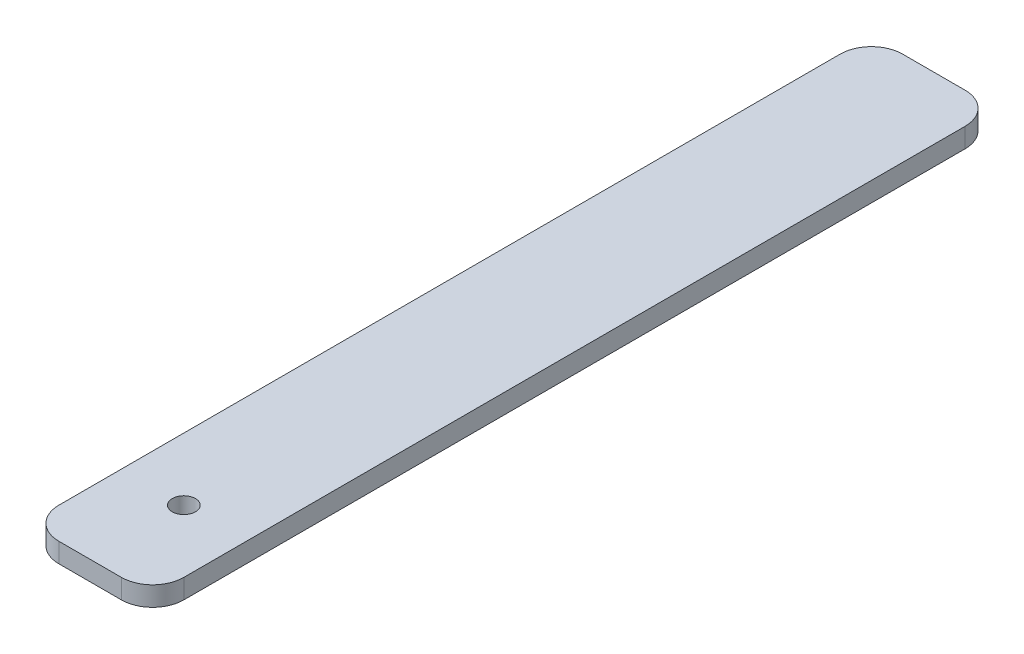
ISO-10303-21;
HEADER;
FILE_DESCRIPTION(('STEP AP214'),'2;1');
FILE_NAME('part.step','',(''),(''),'','','');
FILE_SCHEMA(('AUTOMOTIVE_DESIGN { 1 0 10303 214 1 1 1 1 }'));
ENDSEC;
DATA;
#1=APPLICATION_CONTEXT('core data for automotive mechanical design processes');
#2=APPLICATION_PROTOCOL_DEFINITION('international standard','automotive_design',2000,#1);
#3=PRODUCT_CONTEXT('',#1,'mechanical');
#4=PRODUCT('Part','Part','',(#3));
#5=PRODUCT_RELATED_PRODUCT_CATEGORY('part','',(#4));
#6=PRODUCT_DEFINITION_FORMATION('','',#4);
#7=PRODUCT_DEFINITION_CONTEXT('part definition',#1,'design');
#8=PRODUCT_DEFINITION('design','',#6,#7);
#9=PRODUCT_DEFINITION_SHAPE('','',#8);
#10=(LENGTH_UNIT() NAMED_UNIT(*) SI_UNIT(.MILLI.,.METRE.));
#11=(NAMED_UNIT(*) PLANE_ANGLE_UNIT() SI_UNIT($,.RADIAN.));
#12=(NAMED_UNIT(*) SI_UNIT($,.STERADIAN.) SOLID_ANGLE_UNIT());
#13=UNCERTAINTY_MEASURE_WITH_UNIT(LENGTH_MEASURE(1.E-05),#10,'distance_accuracy_value','');
#14=(GEOMETRIC_REPRESENTATION_CONTEXT(3) GLOBAL_UNCERTAINTY_ASSIGNED_CONTEXT((#13)) GLOBAL_UNIT_ASSIGNED_CONTEXT((#10,
#11,#12)) REPRESENTATION_CONTEXT('',''));
#15=CARTESIAN_POINT('',(0.,0.,0.));
#16=DIRECTION('',(0.,0.,1.));
#17=DIRECTION('',(1.,0.,0.));
#18=AXIS2_PLACEMENT_3D('',#15,#16,#17);
#19=CARTESIAN_POINT('',(0.,1.5875,0.));
#20=DIRECTION('',(0.,-1.,0.));
#21=DIRECTION('',(0.,0.,-1.));
#22=AXIS2_PLACEMENT_3D('',#19,#20,#21);
#23=PLANE('',#22);
#24=DIRECTION('',(-1.,0.,0.));
#25=VECTOR('',#24,1.);
#26=CARTESIAN_POINT('',(0.,1.5875,-68.58));
#27=LINE('',#26,#25);
#28=CARTESIAN_POINT('',(7.62,1.5875,-68.58));
#29=VERTEX_POINT('',#28);
#30=CARTESIAN_POINT('',(2.54,1.5875,-68.58));
#31=VERTEX_POINT('',#30);
#32=EDGE_CURVE('E136',#29,#31,#27,.T.);
#33=ORIENTED_EDGE('',*,*,#32,.T.);
#34=CARTESIAN_POINT('',(2.54,1.5875,-66.04));
#35=DIRECTION('',(0.,-1.,0.));
#36=DIRECTION('',(0.,0.,-1.));
#37=AXIS2_PLACEMENT_3D('',#34,#35,#36);
#38=CIRCLE('',#37,2.54);
#39=CARTESIAN_POINT('',(0.,1.5875,-66.04));
#40=VERTEX_POINT('',#39);
#41=EDGE_CURVE('E155',#31,#40,#38,.F.);
#42=ORIENTED_EDGE('',*,*,#41,.T.);
#43=DIRECTION('',(0.,0.,1.));
#44=VECTOR('',#43,1.);
#45=CARTESIAN_POINT('',(0.,1.5875,0.));
#46=LINE('',#45,#44);
#47=CARTESIAN_POINT('',(0.,1.5875,-2.54));
#48=VERTEX_POINT('',#47);
#49=EDGE_CURVE('E119',#40,#48,#46,.T.);
#50=ORIENTED_EDGE('',*,*,#49,.T.);
#51=CARTESIAN_POINT('',(2.54,1.5875,-2.54));
#52=DIRECTION('',(0.,-1.,0.));
#53=DIRECTION('',(0.,0.,-1.));
#54=AXIS2_PLACEMENT_3D('',#51,#52,#53);
#55=CIRCLE('',#54,2.54);
#56=CARTESIAN_POINT('',(2.54,1.5875,0.));
#57=VERTEX_POINT('',#56);
#58=EDGE_CURVE('E150',#48,#57,#55,.F.);
#59=ORIENTED_EDGE('',*,*,#58,.T.);
#60=DIRECTION('',(1.,0.,0.));
#61=VECTOR('',#60,1.);
#62=CARTESIAN_POINT('',(0.,1.5875,0.));
#63=LINE('',#62,#61);
#64=CARTESIAN_POINT('',(7.62,1.5875,0.));
#65=VERTEX_POINT('',#64);
#66=EDGE_CURVE('E166',#57,#65,#63,.T.);
#67=ORIENTED_EDGE('',*,*,#66,.T.);
#68=CARTESIAN_POINT('',(7.62,1.5875,-2.54));
#69=DIRECTION('',(0.,-1.,0.));
#70=DIRECTION('',(0.,0.,-1.));
#71=AXIS2_PLACEMENT_3D('',#68,#69,#70);
#72=CIRCLE('',#71,2.54);
#73=CARTESIAN_POINT('',(10.16,1.5875,-2.54));
#74=VERTEX_POINT('',#73);
#75=EDGE_CURVE('E55',#65,#74,#72,.F.);
#76=ORIENTED_EDGE('',*,*,#75,.T.);
#77=DIRECTION('',(0.,0.,-1.));
#78=VECTOR('',#77,1.);
#79=CARTESIAN_POINT('',(10.16,1.5875,0.));
#80=LINE('',#79,#78);
#81=CARTESIAN_POINT('',(10.16,1.5875,-66.04));
#82=VERTEX_POINT('',#81);
#83=EDGE_CURVE('E174',#74,#82,#80,.T.);
#84=ORIENTED_EDGE('',*,*,#83,.T.);
#85=CARTESIAN_POINT('',(7.62,1.5875,-66.04));
#86=DIRECTION('',(0.,-1.,0.));
#87=DIRECTION('',(0.,0.,-1.));
#88=AXIS2_PLACEMENT_3D('',#85,#86,#87);
#89=CIRCLE('',#88,2.54);
#90=EDGE_CURVE('E153',#82,#29,#89,.F.);
#91=ORIENTED_EDGE('',*,*,#90,.T.);
#92=EDGE_LOOP('',(#33,#42,#50,#59,#67,#76,#84,#91));
#93=FACE_BOUND('',#92,.T.);
#94=CARTESIAN_POINT('',(5.08,1.5875,-7.62));
#95=DIRECTION('',(0.,1.,0.));
#96=DIRECTION('',(0.,0.,1.));
#97=AXIS2_PLACEMENT_3D('',#94,#95,#96);
#98=CIRCLE('',#97,0.939800000000001);
#99=CARTESIAN_POINT('',(5.08,1.5875,-6.6802));
#100=VERTEX_POINT('',#99);
#101=EDGE_CURVE('E127',#100,#100,#98,.T.);
#102=ORIENTED_EDGE('',*,*,#101,.F.);
#103=EDGE_LOOP('',(#102));
#104=FACE_BOUND('',#103,.T.);
#105=ADVANCED_FACE('F33',(#93,#104),#23,.F.);
#106=CARTESIAN_POINT('',(0.,0.,0.));
#107=DIRECTION('',(0.,-1.,0.));
#108=DIRECTION('',(0.,0.,-1.));
#109=AXIS2_PLACEMENT_3D('',#106,#107,#108);
#110=PLANE('',#109);
#111=DIRECTION('',(0.,0.,1.));
#112=VECTOR('',#111,1.);
#113=CARTESIAN_POINT('',(0.,0.,0.));
#114=LINE('',#113,#112);
#115=CARTESIAN_POINT('',(0.,0.,-66.04));
#116=VERTEX_POINT('',#115);
#117=CARTESIAN_POINT('',(0.,0.,-2.54));
#118=VERTEX_POINT('',#117);
#119=EDGE_CURVE('E116',#116,#118,#114,.T.);
#120=ORIENTED_EDGE('',*,*,#119,.F.);
#121=CARTESIAN_POINT('',(2.54,0.,-66.04));
#122=DIRECTION('',(0.,-1.,0.));
#123=DIRECTION('',(0.,0.,-1.));
#124=AXIS2_PLACEMENT_3D('',#121,#122,#123);
#125=CIRCLE('',#124,2.54);
#126=CARTESIAN_POINT('',(2.54,0.,-68.58));
#127=VERTEX_POINT('',#126);
#128=EDGE_CURVE('E99',#116,#127,#125,.T.);
#129=ORIENTED_EDGE('',*,*,#128,.T.);
#130=DIRECTION('',(-1.,0.,0.));
#131=VECTOR('',#130,1.);
#132=CARTESIAN_POINT('',(0.,0.,-68.58));
#133=LINE('',#132,#131);
#134=CARTESIAN_POINT('',(7.62,0.,-68.58));
#135=VERTEX_POINT('',#134);
#136=EDGE_CURVE('E140',#135,#127,#133,.T.);
#137=ORIENTED_EDGE('',*,*,#136,.F.);
#138=CARTESIAN_POINT('',(7.62,0.,-66.04));
#139=DIRECTION('',(0.,-1.,0.));
#140=DIRECTION('',(0.,0.,-1.));
#141=AXIS2_PLACEMENT_3D('',#138,#139,#140);
#142=CIRCLE('',#141,2.54);
#143=CARTESIAN_POINT('',(10.16,0.,-66.04));
#144=VERTEX_POINT('',#143);
#145=EDGE_CURVE('E110',#135,#144,#142,.T.);
#146=ORIENTED_EDGE('',*,*,#145,.T.);
#147=DIRECTION('',(0.,0.,-1.));
#148=VECTOR('',#147,1.);
#149=CARTESIAN_POINT('',(10.16,0.,0.));
#150=LINE('',#149,#148);
#151=CARTESIAN_POINT('',(10.16,0.,-2.54));
#152=VERTEX_POINT('',#151);
#153=EDGE_CURVE('E130',#152,#144,#150,.T.);
#154=ORIENTED_EDGE('',*,*,#153,.F.);
#155=CARTESIAN_POINT('',(7.62,0.,-2.54));
#156=DIRECTION('',(0.,-1.,0.));
#157=DIRECTION('',(0.,0.,-1.));
#158=AXIS2_PLACEMENT_3D('',#155,#156,#157);
#159=CIRCLE('',#158,2.54);
#160=CARTESIAN_POINT('',(7.62,0.,0.));
#161=VERTEX_POINT('',#160);
#162=EDGE_CURVE('E144',#152,#161,#159,.T.);
#163=ORIENTED_EDGE('',*,*,#162,.T.);
#164=DIRECTION('',(1.,0.,0.));
#165=VECTOR('',#164,1.);
#166=CARTESIAN_POINT('',(0.,0.,0.));
#167=LINE('',#166,#165);
#168=CARTESIAN_POINT('',(2.54,0.,0.));
#169=VERTEX_POINT('',#168);
#170=EDGE_CURVE('E126',#169,#161,#167,.T.);
#171=ORIENTED_EDGE('',*,*,#170,.F.);
#172=CARTESIAN_POINT('',(2.54,0.,-2.54));
#173=DIRECTION('',(0.,-1.,0.));
#174=DIRECTION('',(0.,0.,-1.));
#175=AXIS2_PLACEMENT_3D('',#172,#173,#174);
#176=CIRCLE('',#175,2.54);
#177=EDGE_CURVE('E120',#169,#118,#176,.T.);
#178=ORIENTED_EDGE('',*,*,#177,.T.);
#179=EDGE_LOOP('',(#120,#129,#137,#146,#154,#163,#171,#178));
#180=FACE_BOUND('',#179,.T.);
#181=CARTESIAN_POINT('',(5.08,0.,-7.62));
#182=DIRECTION('',(0.,1.,0.));
#183=DIRECTION('',(0.,0.,1.));
#184=AXIS2_PLACEMENT_3D('',#181,#182,#183);
#185=CIRCLE('',#184,0.939800000000001);
#186=CARTESIAN_POINT('',(5.08,0.,-6.6802));
#187=VERTEX_POINT('',#186);
#188=EDGE_CURVE('E133',#187,#187,#185,.T.);
#189=ORIENTED_EDGE('',*,*,#188,.T.);
#190=EDGE_LOOP('',(#189));
#191=FACE_BOUND('',#190,.T.);
#192=ADVANCED_FACE('F123',(#180,#191),#110,.T.);
#193=CARTESIAN_POINT('',(0.,1.5875,0.));
#194=DIRECTION('',(1.,0.,0.));
#195=DIRECTION('',(0.,0.,-1.));
#196=AXIS2_PLACEMENT_3D('',#193,#194,#195);
#197=PLANE('',#196);
#198=ORIENTED_EDGE('',*,*,#49,.F.);
#199=DIRECTION('',(0.,-1.,0.));
#200=VECTOR('',#199,1.);
#201=CARTESIAN_POINT('',(0.,1.5875,-66.04));
#202=LINE('',#201,#200);
#203=EDGE_CURVE('E103',#40,#116,#202,.T.);
#204=ORIENTED_EDGE('',*,*,#203,.T.);
#205=ORIENTED_EDGE('',*,*,#119,.T.);
#206=DIRECTION('',(0.,-1.,0.));
#207=VECTOR('',#206,1.);
#208=CARTESIAN_POINT('',(0.,1.5875,-2.54));
#209=LINE('',#208,#207);
#210=EDGE_CURVE('E121',#118,#48,#209,.F.);
#211=ORIENTED_EDGE('',*,*,#210,.T.);
#212=EDGE_LOOP('',(#198,#204,#205,#211));
#213=FACE_BOUND('',#212,.T.);
#214=ADVANCED_FACE('F115',(#213),#197,.F.);
#215=CARTESIAN_POINT('',(0.,1.5875,0.));
#216=DIRECTION('',(0.,0.,-1.));
#217=DIRECTION('',(-1.,0.,0.));
#218=AXIS2_PLACEMENT_3D('',#215,#216,#217);
#219=PLANE('',#218);
#220=ORIENTED_EDGE('',*,*,#170,.T.);
#221=DIRECTION('',(0.,-1.,0.));
#222=VECTOR('',#221,1.);
#223=CARTESIAN_POINT('',(7.62,1.5875,0.));
#224=LINE('',#223,#222);
#225=EDGE_CURVE('E11',#161,#65,#224,.F.);
#226=ORIENTED_EDGE('',*,*,#225,.T.);
#227=ORIENTED_EDGE('',*,*,#66,.F.);
#228=DIRECTION('',(0.,-1.,0.));
#229=VECTOR('',#228,1.);
#230=CARTESIAN_POINT('',(2.54,1.5875,0.));
#231=LINE('',#230,#229);
#232=EDGE_CURVE('E41',#57,#169,#231,.T.);
#233=ORIENTED_EDGE('',*,*,#232,.T.);
#234=EDGE_LOOP('',(#220,#226,#227,#233));
#235=FACE_BOUND('',#234,.T.);
#236=ADVANCED_FACE('F164',(#235),#219,.F.);
#237=CARTESIAN_POINT('',(10.16,1.5875,0.));
#238=DIRECTION('',(-1.,0.,0.));
#239=DIRECTION('',(0.,0.,1.));
#240=AXIS2_PLACEMENT_3D('',#237,#238,#239);
#241=PLANE('',#240);
#242=ORIENTED_EDGE('',*,*,#153,.T.);
#243=DIRECTION('',(0.,-1.,0.));
#244=VECTOR('',#243,1.);
#245=CARTESIAN_POINT('',(10.16,1.5875,-66.04));
#246=LINE('',#245,#244);
#247=EDGE_CURVE('E48',#144,#82,#246,.F.);
#248=ORIENTED_EDGE('',*,*,#247,.T.);
#249=ORIENTED_EDGE('',*,*,#83,.F.);
#250=DIRECTION('',(0.,-1.,0.));
#251=VECTOR('',#250,1.);
#252=CARTESIAN_POINT('',(10.16,1.5875,-2.54));
#253=LINE('',#252,#251);
#254=EDGE_CURVE('E157',#74,#152,#253,.T.);
#255=ORIENTED_EDGE('',*,*,#254,.T.);
#256=EDGE_LOOP('',(#242,#248,#249,#255));
#257=FACE_BOUND('',#256,.T.);
#258=ADVANCED_FACE('F173',(#257),#241,.F.);
#259=CARTESIAN_POINT('',(0.,1.5875,-68.58));
#260=DIRECTION('',(0.,0.,1.));
#261=DIRECTION('',(1.,0.,0.));
#262=AXIS2_PLACEMENT_3D('',#259,#260,#261);
#263=PLANE('',#262);
#264=ORIENTED_EDGE('',*,*,#136,.T.);
#265=DIRECTION('',(0.,-1.,0.));
#266=VECTOR('',#265,1.);
#267=CARTESIAN_POINT('',(2.54,1.5875,-68.58));
#268=LINE('',#267,#266);
#269=EDGE_CURVE('E104',#127,#31,#268,.F.);
#270=ORIENTED_EDGE('',*,*,#269,.T.);
#271=ORIENTED_EDGE('',*,*,#32,.F.);
#272=DIRECTION('',(0.,-1.,0.));
#273=VECTOR('',#272,1.);
#274=CARTESIAN_POINT('',(7.62,1.5875,-68.58));
#275=LINE('',#274,#273);
#276=EDGE_CURVE('E109',#29,#135,#275,.T.);
#277=ORIENTED_EDGE('',*,*,#276,.T.);
#278=EDGE_LOOP('',(#264,#270,#271,#277));
#279=FACE_BOUND('',#278,.T.);
#280=ADVANCED_FACE('F185',(#279),#263,.F.);
#281=CARTESIAN_POINT('',(5.08,1.5875,-7.62));
#282=DIRECTION('',(0.,-1.,0.));
#283=DIRECTION('',(0.,0.,-1.));
#284=AXIS2_PLACEMENT_3D('',#281,#282,#283);
#285=CYLINDRICAL_SURFACE('',#284,0.939800000000001);
#286=ORIENTED_EDGE('',*,*,#101,.T.);
#287=EDGE_LOOP('',(#286));
#288=FACE_BOUND('',#287,.T.);
#289=ORIENTED_EDGE('',*,*,#188,.F.);
#290=EDGE_LOOP('',(#289));
#291=FACE_BOUND('',#290,.T.);
#292=ADVANCED_FACE('F183',(#288,#291),#285,.F.);
#293=CARTESIAN_POINT('',(2.54,1.5875,-66.04));
#294=DIRECTION('',(0.,-1.,0.));
#295=DIRECTION('',(0.,0.,-1.));
#296=AXIS2_PLACEMENT_3D('',#293,#294,#295);
#297=CYLINDRICAL_SURFACE('',#296,2.54);
#298=ORIENTED_EDGE('',*,*,#41,.F.);
#299=ORIENTED_EDGE('',*,*,#269,.F.);
#300=ORIENTED_EDGE('',*,*,#128,.F.);
#301=ORIENTED_EDGE('',*,*,#203,.F.);
#302=EDGE_LOOP('',(#298,#299,#300,#301));
#303=FACE_BOUND('',#302,.T.);
#304=ADVANCED_FACE('F102',(#303),#297,.T.);
#305=CARTESIAN_POINT('',(7.62,1.5875,-66.04));
#306=DIRECTION('',(0.,-1.,0.));
#307=DIRECTION('',(0.,0.,-1.));
#308=AXIS2_PLACEMENT_3D('',#305,#306,#307);
#309=CYLINDRICAL_SURFACE('',#308,2.54);
#310=ORIENTED_EDGE('',*,*,#90,.F.);
#311=ORIENTED_EDGE('',*,*,#247,.F.);
#312=ORIENTED_EDGE('',*,*,#145,.F.);
#313=ORIENTED_EDGE('',*,*,#276,.F.);
#314=EDGE_LOOP('',(#310,#311,#312,#313));
#315=FACE_BOUND('',#314,.T.);
#316=ADVANCED_FACE('F192',(#315),#309,.T.);
#317=CARTESIAN_POINT('',(7.62,1.5875,-2.54));
#318=DIRECTION('',(0.,-1.,0.));
#319=DIRECTION('',(0.,0.,-1.));
#320=AXIS2_PLACEMENT_3D('',#317,#318,#319);
#321=CYLINDRICAL_SURFACE('',#320,2.54);
#322=ORIENTED_EDGE('',*,*,#75,.F.);
#323=ORIENTED_EDGE('',*,*,#225,.F.);
#324=ORIENTED_EDGE('',*,*,#162,.F.);
#325=ORIENTED_EDGE('',*,*,#254,.F.);
#326=EDGE_LOOP('',(#322,#323,#324,#325));
#327=FACE_BOUND('',#326,.T.);
#328=ADVANCED_FACE('F172',(#327),#321,.T.);
#329=CARTESIAN_POINT('',(2.54,1.5875,-2.54));
#330=DIRECTION('',(0.,-1.,0.));
#331=DIRECTION('',(0.,0.,-1.));
#332=AXIS2_PLACEMENT_3D('',#329,#330,#331);
#333=CYLINDRICAL_SURFACE('',#332,2.54);
#334=ORIENTED_EDGE('',*,*,#58,.F.);
#335=ORIENTED_EDGE('',*,*,#210,.F.);
#336=ORIENTED_EDGE('',*,*,#177,.F.);
#337=ORIENTED_EDGE('',*,*,#232,.F.);
#338=EDGE_LOOP('',(#334,#335,#336,#337));
#339=FACE_BOUND('',#338,.T.);
#340=ADVANCED_FACE('F35',(#339),#333,.T.);
#341=CLOSED_SHELL('',(#105,#192,#214,#236,#258,#280,#292,#304,#316,#328,#340));
#342=MANIFOLD_SOLID_BREP('B2',#341);
#343=ADVANCED_BREP_SHAPE_REPRESENTATION('',(#18,#342),#14);
#344=SHAPE_DEFINITION_REPRESENTATION(#9,#343);
ENDSEC;
END-ISO-10303-21;
